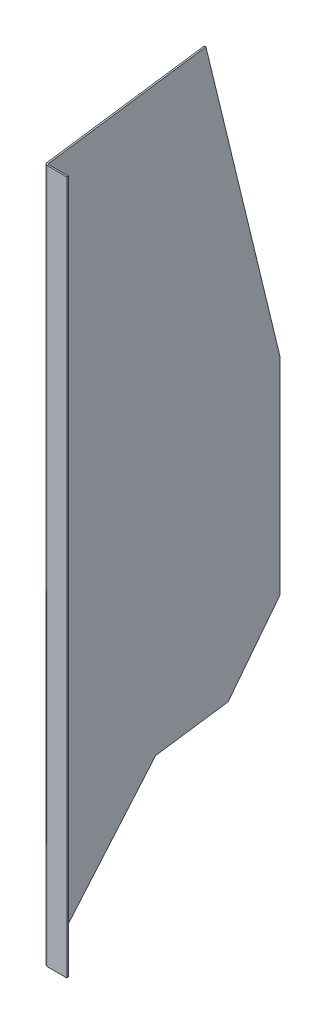
ISO-10303-21;
HEADER;
FILE_DESCRIPTION(('STEP AP214'),'2;1');
FILE_NAME('part.step','',(''),(''),'','','');
FILE_SCHEMA(('AUTOMOTIVE_DESIGN { 1 0 10303 214 1 1 1 1 }'));
ENDSEC;
DATA;
#1=APPLICATION_CONTEXT('core data for automotive mechanical design processes');
#2=APPLICATION_PROTOCOL_DEFINITION('international standard','automotive_design',2000,#1);
#3=PRODUCT_CONTEXT('',#1,'mechanical');
#4=PRODUCT('Part','Part','',(#3));
#5=PRODUCT_RELATED_PRODUCT_CATEGORY('part','',(#4));
#6=PRODUCT_DEFINITION_FORMATION('','',#4);
#7=PRODUCT_DEFINITION_CONTEXT('part definition',#1,'design');
#8=PRODUCT_DEFINITION('design','',#6,#7);
#9=PRODUCT_DEFINITION_SHAPE('','',#8);
#10=(LENGTH_UNIT() NAMED_UNIT(*) SI_UNIT(.MILLI.,.METRE.));
#11=(NAMED_UNIT(*) PLANE_ANGLE_UNIT() SI_UNIT($,.RADIAN.));
#12=(NAMED_UNIT(*) SI_UNIT($,.STERADIAN.) SOLID_ANGLE_UNIT());
#13=UNCERTAINTY_MEASURE_WITH_UNIT(LENGTH_MEASURE(1.E-05),#10,'distance_accuracy_value','');
#14=(GEOMETRIC_REPRESENTATION_CONTEXT(3) GLOBAL_UNCERTAINTY_ASSIGNED_CONTEXT((#13)) GLOBAL_UNIT_ASSIGNED_CONTEXT((#10,
#11,#12)) REPRESENTATION_CONTEXT('',''));
#15=CARTESIAN_POINT('',(0.,0.,0.));
#16=DIRECTION('',(0.,0.,1.));
#17=DIRECTION('',(1.,0.,0.));
#18=AXIS2_PLACEMENT_3D('',#15,#16,#17);
#19=CARTESIAN_POINT('',(-521.,-28.5,611.));
#20=DIRECTION('',(0.,0.,1.));
#21=DIRECTION('',(1.,0.,0.));
#22=AXIS2_PLACEMENT_3D('',#19,#20,#21);
#23=PLANE('',#22);
#24=DIRECTION('',(0.,-1.,0.));
#25=VECTOR('',#24,1.);
#26=CARTESIAN_POINT('',(-521.,-28.5,611.));
#27=LINE('',#26,#25);
#28=CARTESIAN_POINT('',(-521.,-28.5,611.));
#29=VERTEX_POINT('',#28);
#30=CARTESIAN_POINT('',(-521.,-908.,611.));
#31=VERTEX_POINT('',#30);
#32=EDGE_CURVE('E33',#29,#31,#27,.T.);
#33=ORIENTED_EDGE('',*,*,#32,.F.);
#34=DIRECTION('',(-1.,0.,0.));
#35=VECTOR('',#34,1.);
#36=CARTESIAN_POINT('',(-521.,-28.5,611.));
#37=LINE('',#36,#35);
#38=CARTESIAN_POINT('',(-545.81965059919,-28.5,611.));
#39=VERTEX_POINT('',#38);
#40=EDGE_CURVE('E11',#29,#39,#37,.T.);
#41=ORIENTED_EDGE('',*,*,#40,.T.);
#42=DIRECTION('',(0.,-1.,0.));
#43=VECTOR('',#42,1.);
#44=CARTESIAN_POINT('',(-545.81965059919,-28.5,611.));
#45=LINE('',#44,#43);
#46=CARTESIAN_POINT('',(-545.81965059919,-908.,611.));
#47=VERTEX_POINT('',#46);
#48=EDGE_CURVE('E26',#39,#47,#45,.T.);
#49=ORIENTED_EDGE('',*,*,#48,.T.);
#50=DIRECTION('',(1.,0.,0.));
#51=VECTOR('',#50,1.);
#52=CARTESIAN_POINT('',(-545.81965059919,-908.,611.));
#53=LINE('',#52,#51);
#54=EDGE_CURVE('E161',#47,#31,#53,.T.);
#55=ORIENTED_EDGE('',*,*,#54,.T.);
#56=EDGE_LOOP('',(#33,#41,#49,#55));
#57=FACE_BOUND('',#56,.T.);
#58=ADVANCED_FACE('F17',(#57),#23,.T.);
#59=CARTESIAN_POINT('',(-534.55828480544,-908.,610.));
#60=DIRECTION('',(0.,-1.,0.));
#61=DIRECTION('',(1.,0.,0.));
#62=AXIS2_PLACEMENT_3D('',#59,#60,#61);
#63=PLANE('',#62);
#64=DIRECTION('',(1.,0.,0.));
#65=VECTOR('',#64,1.);
#66=CARTESIAN_POINT('',(-545.81965059919,-908.,609.));
#67=LINE('',#66,#65);
#68=CARTESIAN_POINT('',(-545.81965059919,-908.,609.));
#69=VERTEX_POINT('',#68);
#70=CARTESIAN_POINT('',(-521.,-908.,609.));
#71=VERTEX_POINT('',#70);
#72=EDGE_CURVE('E158',#69,#71,#67,.T.);
#73=ORIENTED_EDGE('',*,*,#72,.T.);
#74=DIRECTION('',(0.,0.,-1.));
#75=VECTOR('',#74,1.);
#76=CARTESIAN_POINT('',(-521.,-908.,611.));
#77=LINE('',#76,#75);
#78=EDGE_CURVE('E104',#31,#71,#77,.T.);
#79=ORIENTED_EDGE('',*,*,#78,.F.);
#80=ORIENTED_EDGE('',*,*,#54,.F.);
#81=DIRECTION('',(0.,0.,-1.));
#82=VECTOR('',#81,1.);
#83=CARTESIAN_POINT('',(-545.81965059919,-908.,611.));
#84=LINE('',#83,#82);
#85=EDGE_CURVE('E132',#47,#69,#84,.T.);
#86=ORIENTED_EDGE('',*,*,#85,.T.);
#87=EDGE_LOOP('',(#73,#79,#80,#86));
#88=FACE_BOUND('',#87,.T.);
#89=ADVANCED_FACE('F176',(#88),#63,.T.);
#90=CARTESIAN_POINT('',(-549.39217522634,-905.1582556658,607.843923178521));
#91=CARTESIAN_POINT('',(-548.73059659168,-905.1582556658,607.761715182499));
#92=CARTESIAN_POINT('',(-548.06901795702,-905.1582556658,607.679507186476));
#93=CARTESIAN_POINT('',(-547.40743932237,-905.1582556658,607.597299190454));
#94=CARTESIAN_POINT('',(-549.3707608211,-905.252980477,608.016258154026));
#95=CARTESIAN_POINT('',(-548.71314781704,-905.252980477,607.902136273651));
#96=CARTESIAN_POINT('',(-548.05553481298,-905.252980477,607.788014393276));
#97=CARTESIAN_POINT('',(-547.39792180893,-905.252980477,607.673892512901));
#98=CARTESIAN_POINT('',(-549.30294884046,-905.4424300992,608.357822206609));
#99=CARTESIAN_POINT('',(-548.6578936106,-905.4424300992,608.180447723904));
#100=CARTESIAN_POINT('',(-548.01283838073,-905.4424300992,608.003073241198));
#101=CARTESIAN_POINT('',(-547.36778315087,-905.4424300992,607.825698758493));
#102=CARTESIAN_POINT('',(-549.12840723641,-905.7266045327,608.850144767545));
#103=CARTESIAN_POINT('',(-548.51567452582,-905.7266045327,608.581599440222));
#104=CARTESIAN_POINT('',(-547.90294181522,-905.7266045327,608.313054112899));
#105=CARTESIAN_POINT('',(-547.29020910462,-905.7266045327,608.044508785576));
#106=CARTESIAN_POINT('',(-548.88469123288,-906.0107789661,609.312149599986));
#107=CARTESIAN_POINT('',(-548.31709111553,-906.0107789661,608.958047822211));
#108=CARTESIAN_POINT('',(-547.74949099818,-906.0107789661,608.603946044436));
#109=CARTESIAN_POINT('',(-547.18189088083,-906.0107789661,608.249844266661));
#110=CARTESIAN_POINT('',(-548.57689602365,-906.2949533995,609.734178208289));
#111=CARTESIAN_POINT('',(-548.06629501912,-906.2949533995,609.301922984532));
#112=CARTESIAN_POINT('',(-547.55569401459,-906.2949533995,608.869667760775));
#113=CARTESIAN_POINT('',(-547.04509301006,-906.2949533995,608.437412537017));
#114=CARTESIAN_POINT('',(-548.21145653276,-906.5791278329,610.107407355516));
#115=CARTESIAN_POINT('',(-547.76852950803,-906.5791278329,609.606035623013));
#116=CARTESIAN_POINT('',(-547.32560248329,-906.5791278329,609.10466389051));
#117=CARTESIAN_POINT('',(-546.88267545856,-906.5791278329,608.603292158007));
#118=CARTESIAN_POINT('',(-547.79601281599,-906.8633022663,610.424034164285));
#119=CARTESIAN_POINT('',(-547.43001981288,-906.8633022663,609.864027837566));
#120=CARTESIAN_POINT('',(-547.06402680977,-906.8633022663,609.304021510846));
#121=CARTESIAN_POINT('',(-546.69803380666,-906.8633022663,608.744015184127));
#122=CARTESIAN_POINT('',(-547.33925030928,-907.1474766997,610.677439076468));
#123=CARTESIAN_POINT('',(-547.05784295556,-907.1474766997,610.070505914159));
#124=CARTESIAN_POINT('',(-546.77643560184,-907.1474766997,609.46357275185));
#125=CARTESIAN_POINT('',(-546.49502824812,-907.1474766997,608.856639589541));
#126=CARTESIAN_POINT('',(-546.85071841353,-907.4316511332,610.862324290621));
#127=CARTESIAN_POINT('',(-546.6597799294,-907.4316511332,610.221153125691));
#128=CARTESIAN_POINT('',(-546.46884144526,-907.4316511332,609.579981960761));
#129=CARTESIAN_POINT('',(-546.27790296112,-907.4316511332,608.938810795831));
#130=CARTESIAN_POINT('',(-546.34063020878,-907.7158255666,610.974824508069));
#131=CARTESIAN_POINT('',(-546.2441525033,-907.7158255666,610.312819969538));
#132=CARTESIAN_POINT('',(-546.14767479782,-907.7158255666,609.650815431006));
#133=CARTESIAN_POINT('',(-546.05119709234,-907.7158255666,608.988810892475));
#134=CARTESIAN_POINT('',(-545.9933109589,-907.9052751889,611.));
#135=CARTESIAN_POINT('',(-545.96115163303,-907.9052751889,610.333333333333));
#136=CARTESIAN_POINT('',(-545.92899230716,-907.9052751889,609.666666666667));
#137=CARTESIAN_POINT('',(-545.89683298128,-907.9052751889,609.));
#138=CARTESIAN_POINT('',(-545.81965059919,-908.,611.));
#139=CARTESIAN_POINT('',(-545.81965059919,-908.,610.333333333333));
#140=CARTESIAN_POINT('',(-545.81965059919,-908.,609.666666666667));
#141=CARTESIAN_POINT('',(-545.81965059919,-908.,609.));
#142=(BOUNDED_SURFACE() B_SPLINE_SURFACE(3,3,((#90,#91,#92,#93),(#94,#95,#96,#97),(#98,#99,#100,
#101),(#102,#103,#104,#105),(#106,#107,#108,#109),(#110,#111,#112,#113),(#114,#115,#116,#117),
(#118,#119,#120,#121),(#122,#123,#124,#125),(#126,#127,#128,#129),(#130,#131,#132,#133),(#134,
#135,#136,#137),(#138,#139,#140,#141)),.UNSPECIFIED.,.F.,.F.,
.F.) B_SPLINE_SURFACE_WITH_KNOTS((4,1,1,1,1,1,1,1,1,1,4),(4,4),(0.,0.1,0.2,0.3,0.4,0.5,0.6,0.7,
0.8,0.9,1.),(0.,1.),
.UNSPECIFIED.) GEOMETRIC_REPRESENTATION_ITEM() RATIONAL_B_SPLINE_SURFACE(((1.,1.,1.,1.),(1.,1.,
1.,1.),(1.,1.,1.,1.),(1.,1.,1.,1.),(1.,1.,1.,1.),(1.,1.,1.,1.),(1.,1.,1.,1.),(1.,1.,1.,1.),(1.,
1.,1.,1.),(1.,1.,1.,1.),(1.,1.,1.,1.),(1.,1.,1.,1.),(1.,1.,1.,1.))) REPRESENTATION_ITEM('') SURFACE());
#143=DIRECTION('',(0.992367951985267,0.,-0.123311994033696));
#144=VECTOR('',#143,1.);
#145=CARTESIAN_POINT('',(-549.39217522634,-905.1582556658,607.843923178521));
#146=LINE('',#145,#144);
#147=CARTESIAN_POINT('',(-549.39217522634,-905.1582556658,607.843923178521));
#148=VERTEX_POINT('',#147);
#149=CARTESIAN_POINT('',(-547.40743932237,-905.1582556658,607.597299190454));
#150=VERTEX_POINT('',#149);
#151=EDGE_CURVE('E130',#148,#150,#146,.T.);
#152=CARTESIAN_POINT('',(-547.40743932237,-905.1582556658,607.597299190454));
#153=CARTESIAN_POINT('',(-547.39792180893,-905.252980477,607.673892512901));
#154=CARTESIAN_POINT('',(-547.36778315087,-905.4424300992,607.825698758493));
#155=CARTESIAN_POINT('',(-547.29020910462,-905.7266045327,608.044508785576));
#156=CARTESIAN_POINT('',(-547.18189088083,-906.0107789661,608.249844266661));
#157=CARTESIAN_POINT('',(-547.04509301006,-906.2949533995,608.437412537017));
#158=CARTESIAN_POINT('',(-546.88267545856,-906.5791278329,608.603292158007));
#159=CARTESIAN_POINT('',(-546.69803380666,-906.8633022663,608.744015184127));
#160=CARTESIAN_POINT('',(-546.49502824812,-907.1474766997,608.856639589541));
#161=CARTESIAN_POINT('',(-546.27790296112,-907.4316511332,608.938810795831));
#162=CARTESIAN_POINT('',(-546.05119709234,-907.7158255666,608.988810892475));
#163=CARTESIAN_POINT('',(-545.89683298128,-907.9052751889,609.));
#164=CARTESIAN_POINT('',(-545.81965059919,-908.,609.));
#165=(BOUNDED_CURVE() B_SPLINE_CURVE(3,(#152,#153,#154,#155,#156,#157,#158,#159,#160,#161,#162,
#163,#164),.UNSPECIFIED.,.F.,.F.) B_SPLINE_CURVE_WITH_KNOTS((4,1,1,1,1,1,1,1,1,1,4),(0.,0.1,0.2,
0.3,0.4,0.5,0.6,0.7,0.8,0.9,1.),
.UNSPECIFIED.) CURVE() GEOMETRIC_REPRESENTATION_ITEM() RATIONAL_B_SPLINE_CURVE((1.,1.,1.,1.,1.,
1.,1.,1.,1.,1.,1.,1.,1.)) REPRESENTATION_ITEM(''));
#166=EDGE_CURVE('E133',#150,#69,#165,.T.);
#167=CARTESIAN_POINT('',(-549.39217522634,-905.1582556658,607.843923178521));
#168=CARTESIAN_POINT('',(-549.3707608211,-905.252980477,608.016258154026));
#169=CARTESIAN_POINT('',(-549.30294884046,-905.4424300992,608.357822206609));
#170=CARTESIAN_POINT('',(-549.12840723641,-905.7266045327,608.850144767545));
#171=CARTESIAN_POINT('',(-548.88469123288,-906.0107789661,609.312149599986));
#172=CARTESIAN_POINT('',(-548.57689602365,-906.2949533995,609.734178208289));
#173=CARTESIAN_POINT('',(-548.21145653276,-906.5791278329,610.107407355516));
#174=CARTESIAN_POINT('',(-547.79601281599,-906.8633022663,610.424034164285));
#175=CARTESIAN_POINT('',(-547.33925030928,-907.1474766997,610.677439076468));
#176=CARTESIAN_POINT('',(-546.85071841353,-907.4316511332,610.862324290621));
#177=CARTESIAN_POINT('',(-546.34063020878,-907.7158255666,610.974824508069));
#178=CARTESIAN_POINT('',(-545.9933109589,-907.9052751889,611.));
#179=CARTESIAN_POINT('',(-545.81965059919,-908.,611.));
#180=(BOUNDED_CURVE() B_SPLINE_CURVE(3,(#167,#168,#169,#170,#171,#172,#173,#174,#175,#176,#177,
#178,#179),.UNSPECIFIED.,.F.,.F.) B_SPLINE_CURVE_WITH_KNOTS((4,1,1,1,1,1,1,1,1,1,4),(0.,0.1,0.2,
0.3,0.4,0.5,0.6,0.7,0.8,0.9,1.),
.UNSPECIFIED.) CURVE() GEOMETRIC_REPRESENTATION_ITEM() RATIONAL_B_SPLINE_CURVE((1.,1.,1.,1.,1.,
1.,1.,1.,1.,1.,1.,1.,1.)) REPRESENTATION_ITEM(''));
#181=EDGE_CURVE('E189',#148,#47,#180,.T.);
#182=ORIENTED_EDGE('',*,*,#151,.T.);
#183=ORIENTED_EDGE('',*,*,#166,.T.);
#184=ORIENTED_EDGE('',*,*,#85,.F.);
#185=ORIENTED_EDGE('',*,*,#181,.F.);
#186=EDGE_LOOP('',(#182,#183,#184,#185));
#187=FACE_BOUND('',#186,.T.);
#188=ADVANCED_FACE('F233',(#187),#142,.F.);
#189=CARTESIAN_POINT('',(-545.81965059919,-28.5,607.4));
#190=DIRECTION('',(0.,1.,0.));
#191=DIRECTION('',(-0.992367951985267,0.,0.123311994033696));
#192=AXIS2_PLACEMENT_3D('',#189,#190,#191);
#193=CYLINDRICAL_SURFACE('',#192,3.6);
#194=ORIENTED_EDGE('',*,*,#181,.T.);
#195=ORIENTED_EDGE('',*,*,#48,.F.);
#196=CARTESIAN_POINT('',(-545.81965059919,-28.5,607.4));
#197=DIRECTION('',(0.,1.,0.));
#198=DIRECTION('',(-0.992367951985267,0.,0.123311994033696));
#199=AXIS2_PLACEMENT_3D('',#196,#197,#198);
#200=CIRCLE('',#199,3.6);
#201=CARTESIAN_POINT('',(-549.39217522634,-28.5,607.843923178521));
#202=VERTEX_POINT('',#201);
#203=EDGE_CURVE('E42',#202,#39,#200,.T.);
#204=ORIENTED_EDGE('',*,*,#203,.F.);
#205=DIRECTION('',(0.,-1.,0.));
#206=VECTOR('',#205,1.);
#207=CARTESIAN_POINT('',(-549.39217522634,-28.5,607.843923178521));
#208=LINE('',#207,#206);
#209=EDGE_CURVE('E141',#202,#148,#208,.T.);
#210=ORIENTED_EDGE('',*,*,#209,.T.);
#211=EDGE_LOOP('',(#194,#195,#204,#210));
#212=FACE_BOUND('',#211,.T.);
#213=ADVANCED_FACE('F239',(#212),#193,.T.);
#214=CARTESIAN_POINT('',(-549.,-28.5,611.));
#215=DIRECTION('',(-0.992367951985267,0.,0.123311994033696));
#216=DIRECTION('',(0.,-1.,0.));
#217=AXIS2_PLACEMENT_3D('',#214,#215,#216);
#218=PLANE('',#217);
#219=ORIENTED_EDGE('',*,*,#209,.F.);
#220=DIRECTION('',(-0.123311994033696,0.,-0.992367951985267));
#221=VECTOR('',#220,1.);
#222=CARTESIAN_POINT('',(-549.39217522634,-28.5,607.843923178521));
#223=LINE('',#222,#221);
#224=CARTESIAN_POINT('',(-577.68181528745,-28.5,380.1796769724));
#225=VERTEX_POINT('',#224);
#226=EDGE_CURVE('E139',#202,#225,#223,.T.);
#227=ORIENTED_EDGE('',*,*,#226,.T.);
#228=DIRECTION('',(-0.0321443268651114,-0.965426672144242,-0.258685297152511));
#229=VECTOR('',#228,1.);
#230=CARTESIAN_POINT('',(-577.68181528745,-28.5,380.1796769724));
#231=LINE('',#230,#229);
#232=CARTESIAN_POINT('',(-591.,-428.5,273.));
#233=VERTEX_POINT('',#232);
#234=EDGE_CURVE('E142',#225,#233,#231,.T.);
#235=ORIENTED_EDGE('',*,*,#234,.T.);
#236=DIRECTION('',(0.,-1.,0.));
#237=VECTOR('',#236,1.);
#238=CARTESIAN_POINT('',(-591.,-428.5,273.));
#239=LINE('',#238,#237);
#240=CARTESIAN_POINT('',(-591.,-690.7361610009,273.));
#241=VERTEX_POINT('',#240);
#242=EDGE_CURVE('E143',#233,#241,#239,.T.);
#243=ORIENTED_EDGE('',*,*,#242,.T.);
#244=DIRECTION('',(0.0875281168452047,-0.704392940325757,0.704392940325757));
#245=VECTOR('',#244,1.);
#246=CARTESIAN_POINT('',(-591.,-690.7361610009,273.));
#247=LINE('',#246,#245);
#248=CARTESIAN_POINT('',(-581.68047337278,-765.7361610009,348.));
#249=VERTEX_POINT('',#248);
#250=EDGE_CURVE('E107',#241,#249,#247,.T.);
#251=ORIENTED_EDGE('',*,*,#250,.T.);
#252=DIRECTION('',(0.123311994033696,0.,0.992367951985267));
#253=VECTOR('',#252,1.);
#254=CARTESIAN_POINT('',(-581.68047337278,-765.7361610009,348.));
#255=LINE('',#254,#253);
#256=CARTESIAN_POINT('',(-568.63313609467,-765.7361610009,453.));
#257=VERTEX_POINT('',#256);
#258=EDGE_CURVE('E99',#249,#257,#255,.T.);
#259=ORIENTED_EDGE('',*,*,#258,.T.);
#260=DIRECTION('',(0.0919522195150205,-0.666295781255203,0.739996433239904));
#261=VECTOR('',#260,1.);
#262=CARTESIAN_POINT('',(-568.63313609467,-765.7361610009,453.));
#263=LINE('',#262,#261);
#264=EDGE_CURVE('E108',#257,#148,#263,.T.);
#265=ORIENTED_EDGE('',*,*,#264,.T.);
#266=EDGE_LOOP('',(#219,#227,#235,#243,#251,#259,#265));
#267=FACE_BOUND('',#266,.T.);
#268=ADVANCED_FACE('F237',(#267),#218,.T.);
#269=CARTESIAN_POINT('',(-558.02028770852,-835.4472083334,530.29864959523));
#270=DIRECTION('',(-0.0821622614028132,-0.745687556474929,-0.661210579860626));
#271=DIRECTION('',(-0.992367951985268,0.,0.123311994033693));
#272=AXIS2_PLACEMENT_3D('',#269,#270,#271);
#273=PLANE('',#272);
#274=DIRECTION('',(0.992367951985267,0.,-0.123311994033696));
#275=VECTOR('',#274,1.);
#276=CARTESIAN_POINT('',(-568.63313609467,-765.7361610009,453.));
#277=LINE('',#276,#275);
#278=CARTESIAN_POINT('',(-566.6484001907,-765.7361610009,452.7533760119));
#279=VERTEX_POINT('',#278);
#280=EDGE_CURVE('E156',#257,#279,#277,.T.);
#281=ORIENTED_EDGE('',*,*,#280,.T.);
#282=DIRECTION('',(0.0919522195150205,-0.666295781255203,0.739996433239904));
#283=VECTOR('',#282,1.);
#284=CARTESIAN_POINT('',(-566.6484001907,-765.7361610009,452.7533760119));
#285=LINE('',#284,#283);
#286=EDGE_CURVE('E72',#279,#150,#285,.T.);
#287=ORIENTED_EDGE('',*,*,#286,.T.);
#288=ORIENTED_EDGE('',*,*,#151,.F.);
#289=ORIENTED_EDGE('',*,*,#264,.F.);
#290=EDGE_LOOP('',(#281,#287,#288,#289));
#291=FACE_BOUND('',#290,.T.);
#292=ADVANCED_FACE('F235',(#291),#273,.T.);
#293=CARTESIAN_POINT('',(-547.01526409603,-28.5,610.753376011933));
#294=DIRECTION('',(-0.992367951985267,0.,0.123311994033696));
#295=DIRECTION('',(0.,-1.,0.));
#296=AXIS2_PLACEMENT_3D('',#293,#294,#295);
#297=PLANE('',#296);
#298=DIRECTION('',(0.123311994033696,0.,0.992367951985267));
#299=VECTOR('',#298,1.);
#300=CARTESIAN_POINT('',(-579.69573746881,-765.7361610009,347.7533760119));
#301=LINE('',#300,#299);
#302=CARTESIAN_POINT('',(-579.69573746881,-765.7361610009,347.7533760119));
#303=VERTEX_POINT('',#302);
#304=EDGE_CURVE('E78',#303,#279,#301,.T.);
#305=ORIENTED_EDGE('',*,*,#304,.F.);
#306=DIRECTION('',(0.0875281168452047,-0.704392940325757,0.704392940325757));
#307=VECTOR('',#306,1.);
#308=CARTESIAN_POINT('',(-589.01526409603,-690.7361610009,272.7533760119));
#309=LINE('',#308,#307);
#310=CARTESIAN_POINT('',(-589.01526409603,-690.7361610009,272.7533760119));
#311=VERTEX_POINT('',#310);
#312=EDGE_CURVE('E81',#311,#303,#309,.T.);
#313=ORIENTED_EDGE('',*,*,#312,.F.);
#314=DIRECTION('',(0.,-1.,0.));
#315=VECTOR('',#314,1.);
#316=CARTESIAN_POINT('',(-589.01526409603,-428.5,272.7533760119));
#317=LINE('',#316,#315);
#318=CARTESIAN_POINT('',(-589.01526409603,-428.5,272.7533760119));
#319=VERTEX_POINT('',#318);
#320=EDGE_CURVE('E166',#319,#311,#317,.T.);
#321=ORIENTED_EDGE('',*,*,#320,.F.);
#322=DIRECTION('',(-0.0321443268651114,-0.965426672144242,-0.258685297152511));
#323=VECTOR('',#322,1.);
#324=CARTESIAN_POINT('',(-575.69707938348,-28.5,379.9330529844));
#325=LINE('',#324,#323);
#326=CARTESIAN_POINT('',(-575.69707938348,-28.5,379.9330529844));
#327=VERTEX_POINT('',#326);
#328=EDGE_CURVE('E116',#327,#319,#325,.T.);
#329=ORIENTED_EDGE('',*,*,#328,.F.);
#330=DIRECTION('',(-0.123311994033696,0.,-0.992367951985267));
#331=VECTOR('',#330,1.);
#332=CARTESIAN_POINT('',(-547.40743932237,-28.5,607.597299190454));
#333=LINE('',#332,#331);
#334=CARTESIAN_POINT('',(-547.40743932237,-28.5,607.597299190454));
#335=VERTEX_POINT('',#334);
#336=EDGE_CURVE('E114',#335,#327,#333,.T.);
#337=ORIENTED_EDGE('',*,*,#336,.F.);
#338=DIRECTION('',(0.,-1.,0.));
#339=VECTOR('',#338,1.);
#340=CARTESIAN_POINT('',(-547.40743932237,-28.5,607.597299190454));
#341=LINE('',#340,#339);
#342=EDGE_CURVE('E109',#335,#150,#341,.T.);
#343=ORIENTED_EDGE('',*,*,#342,.T.);
#344=ORIENTED_EDGE('',*,*,#286,.F.);
#345=EDGE_LOOP('',(#305,#313,#321,#329,#337,#343,#344));
#346=FACE_BOUND('',#345,.T.);
#347=ADVANCED_FACE('F80',(#346),#297,.F.);
#348=CARTESIAN_POINT('',(-545.81965059919,-28.5,607.4));
#349=DIRECTION('',(0.,1.,0.));
#350=DIRECTION('',(-0.992367951985267,0.,0.123311994033696));
#351=AXIS2_PLACEMENT_3D('',#348,#349,#350);
#352=CYLINDRICAL_SURFACE('',#351,1.6);
#353=CARTESIAN_POINT('',(-545.81965059919,-28.5,607.4));
#354=DIRECTION('',(0.,1.,0.));
#355=DIRECTION('',(-0.992367951985267,0.,0.123311994033696));
#356=AXIS2_PLACEMENT_3D('',#353,#354,#355);
#357=CIRCLE('',#356,1.6);
#358=CARTESIAN_POINT('',(-545.81965059919,-28.5,609.));
#359=VERTEX_POINT('',#358);
#360=EDGE_CURVE('E21',#335,#359,#357,.T.);
#361=ORIENTED_EDGE('',*,*,#360,.T.);
#362=DIRECTION('',(0.,-1.,0.));
#363=VECTOR('',#362,1.);
#364=CARTESIAN_POINT('',(-545.81965059919,-28.5,609.));
#365=LINE('',#364,#363);
#366=EDGE_CURVE('E135',#359,#69,#365,.T.);
#367=ORIENTED_EDGE('',*,*,#366,.T.);
#368=ORIENTED_EDGE('',*,*,#166,.F.);
#369=ORIENTED_EDGE('',*,*,#342,.F.);
#370=EDGE_LOOP('',(#361,#367,#368,#369));
#371=FACE_BOUND('',#370,.T.);
#372=ADVANCED_FACE('F228',(#371),#352,.F.);
#373=CARTESIAN_POINT('',(-521.,-28.5,609.));
#374=DIRECTION('',(0.,0.,1.));
#375=DIRECTION('',(1.,0.,0.));
#376=AXIS2_PLACEMENT_3D('',#373,#374,#375);
#377=PLANE('',#376);
#378=ORIENTED_EDGE('',*,*,#366,.F.);
#379=DIRECTION('',(-1.,0.,0.));
#380=VECTOR('',#379,1.);
#381=CARTESIAN_POINT('',(-521.,-28.5,609.));
#382=LINE('',#381,#380);
#383=CARTESIAN_POINT('',(-521.,-28.5,609.));
#384=VERTEX_POINT('',#383);
#385=EDGE_CURVE('E122',#384,#359,#382,.T.);
#386=ORIENTED_EDGE('',*,*,#385,.F.);
#387=DIRECTION('',(0.,-1.,0.));
#388=VECTOR('',#387,1.);
#389=CARTESIAN_POINT('',(-521.,-28.5,609.));
#390=LINE('',#389,#388);
#391=EDGE_CURVE('E138',#384,#71,#390,.T.);
#392=ORIENTED_EDGE('',*,*,#391,.T.);
#393=ORIENTED_EDGE('',*,*,#72,.F.);
#394=EDGE_LOOP('',(#378,#386,#392,#393));
#395=FACE_BOUND('',#394,.T.);
#396=ADVANCED_FACE('F246',(#395),#377,.F.);
#397=CARTESIAN_POINT('',(-521.,-468.25,610.));
#398=DIRECTION('',(-1.,0.,0.));
#399=DIRECTION('',(0.,-1.,0.));
#400=AXIS2_PLACEMENT_3D('',#397,#398,#399);
#401=PLANE('',#400);
#402=ORIENTED_EDGE('',*,*,#78,.T.);
#403=ORIENTED_EDGE('',*,*,#391,.F.);
#404=DIRECTION('',(0.,0.,-1.));
#405=VECTOR('',#404,1.);
#406=CARTESIAN_POINT('',(-521.,-28.5,611.));
#407=LINE('',#406,#405);
#408=EDGE_CURVE('E125',#29,#384,#407,.T.);
#409=ORIENTED_EDGE('',*,*,#408,.F.);
#410=ORIENTED_EDGE('',*,*,#32,.T.);
#411=EDGE_LOOP('',(#402,#403,#409,#410));
#412=FACE_BOUND('',#411,.T.);
#413=ADVANCED_FACE('F19',(#412),#401,.F.);
#414=CARTESIAN_POINT('',(-534.55828480544,-28.5,610.));
#415=DIRECTION('',(0.,1.,0.));
#416=DIRECTION('',(0.,0.,-1.));
#417=AXIS2_PLACEMENT_3D('',#414,#415,#416);
#418=PLANE('',#417);
#419=ORIENTED_EDGE('',*,*,#40,.F.);
#420=ORIENTED_EDGE('',*,*,#408,.T.);
#421=ORIENTED_EDGE('',*,*,#385,.T.);
#422=DIRECTION('',(0.,0.,-1.));
#423=VECTOR('',#422,1.);
#424=CARTESIAN_POINT('',(-545.81965059919,-28.5,611.));
#425=LINE('',#424,#423);
#426=EDGE_CURVE('E126',#39,#359,#425,.T.);
#427=ORIENTED_EDGE('',*,*,#426,.F.);
#428=EDGE_LOOP('',(#419,#420,#421,#427));
#429=FACE_BOUND('',#428,.T.);
#430=ADVANCED_FACE('F241',(#429),#418,.T.);
#431=CARTESIAN_POINT('',(-547.54104696847,-28.5,609.348536512317));
#432=DIRECTION('',(0.,-1.,0.));
#433=DIRECTION('',(1.,0.,0.));
#434=AXIS2_PLACEMENT_3D('',#431,#432,#433);
#435=PLANE('',#434);
#436=ORIENTED_EDGE('',*,*,#426,.T.);
#437=ORIENTED_EDGE('',*,*,#360,.F.);
#438=DIRECTION('',(0.992367951985267,0.,-0.123311994033696));
#439=VECTOR('',#438,1.);
#440=CARTESIAN_POINT('',(-549.39217522634,-28.5,607.843923178521));
#441=LINE('',#440,#439);
#442=EDGE_CURVE('E111',#202,#335,#441,.T.);
#443=ORIENTED_EDGE('',*,*,#442,.F.);
#444=ORIENTED_EDGE('',*,*,#203,.T.);
#445=EDGE_LOOP('',(#436,#437,#443,#444));
#446=FACE_BOUND('',#445,.T.);
#447=ADVANCED_FACE('F225',(#446),#435,.F.);
#448=CARTESIAN_POINT('',(-562.40300847317,-28.5,495.0281824892));
#449=DIRECTION('',(0.,1.,0.));
#450=DIRECTION('',(0.,0.,-1.));
#451=AXIS2_PLACEMENT_3D('',#448,#449,#450);
#452=PLANE('',#451);
#453=ORIENTED_EDGE('',*,*,#336,.T.);
#454=DIRECTION('',(0.992367951985267,0.,-0.123311994033696));
#455=VECTOR('',#454,1.);
#456=CARTESIAN_POINT('',(-577.68181528745,-28.5,380.1796769724));
#457=LINE('',#456,#455);
#458=EDGE_CURVE('E115',#225,#327,#457,.T.);
#459=ORIENTED_EDGE('',*,*,#458,.F.);
#460=ORIENTED_EDGE('',*,*,#226,.F.);
#461=ORIENTED_EDGE('',*,*,#442,.T.);
#462=EDGE_LOOP('',(#453,#459,#460,#461));
#463=FACE_BOUND('',#462,.T.);
#464=ADVANCED_FACE('F217',(#463),#452,.T.);
#465=CARTESIAN_POINT('',(-583.34853969174,-228.5,326.4665264922));
#466=DIRECTION('',(-0.119048688035406,0.260674779586512,-0.958058489427745));
#467=DIRECTION('',(0.,0.964920601761245,0.262541867702501));
#468=AXIS2_PLACEMENT_3D('',#465,#466,#467);
#469=PLANE('',#468);
#470=ORIENTED_EDGE('',*,*,#458,.T.);
#471=ORIENTED_EDGE('',*,*,#328,.T.);
#472=DIRECTION('',(0.992367951985267,0.,-0.123311994033696));
#473=VECTOR('',#472,1.);
#474=CARTESIAN_POINT('',(-591.,-428.5,273.));
#475=LINE('',#474,#473);
#476=EDGE_CURVE('E119',#233,#319,#475,.T.);
#477=ORIENTED_EDGE('',*,*,#476,.F.);
#478=ORIENTED_EDGE('',*,*,#234,.F.);
#479=EDGE_LOOP('',(#470,#471,#477,#478));
#480=FACE_BOUND('',#479,.T.);
#481=ADVANCED_FACE('F213',(#480),#469,.T.);
#482=CARTESIAN_POINT('',(-590.00763204801,-559.6180805005,272.876688006));
#483=DIRECTION('',(-0.123311994033696,0.,-0.992367951985267));
#484=DIRECTION('',(-0.992367951985267,0.,0.123311994033696));
#485=AXIS2_PLACEMENT_3D('',#482,#483,#484);
#486=PLANE('',#485);
#487=ORIENTED_EDGE('',*,*,#476,.T.);
#488=ORIENTED_EDGE('',*,*,#320,.T.);
#489=DIRECTION('',(0.992367951985267,0.,-0.123311994033696));
#490=VECTOR('',#489,1.);
#491=CARTESIAN_POINT('',(-591.,-690.7361610009,273.));
#492=LINE('',#491,#490);
#493=EDGE_CURVE('E94',#241,#311,#492,.T.);
#494=ORIENTED_EDGE('',*,*,#493,.F.);
#495=ORIENTED_EDGE('',*,*,#242,.F.);
#496=EDGE_LOOP('',(#487,#488,#494,#495));
#497=FACE_BOUND('',#496,.T.);
#498=ADVANCED_FACE('F209',(#497),#486,.T.);
#499=CARTESIAN_POINT('',(-585.34786873441,-728.2361610009,310.376688006));
#500=DIRECTION('',(-0.0868600980548202,-0.709810246206102,-0.699016979584002));
#501=DIRECTION('',(-0.99236795198527,0.,0.123311994033677));
#502=AXIS2_PLACEMENT_3D('',#499,#500,#501);
#503=PLANE('',#502);
#504=ORIENTED_EDGE('',*,*,#493,.T.);
#505=ORIENTED_EDGE('',*,*,#312,.T.);
#506=DIRECTION('',(0.992367951985267,0.,-0.123311994033696));
#507=VECTOR('',#506,1.);
#508=CARTESIAN_POINT('',(-581.68047337278,-765.7361610009,348.));
#509=LINE('',#508,#507);
#510=EDGE_CURVE('E86',#249,#303,#509,.T.);
#511=ORIENTED_EDGE('',*,*,#510,.F.);
#512=ORIENTED_EDGE('',*,*,#250,.F.);
#513=EDGE_LOOP('',(#504,#505,#511,#512));
#514=FACE_BOUND('',#513,.T.);
#515=ADVANCED_FACE('F91',(#514),#503,.T.);
#516=CARTESIAN_POINT('',(-574.16443678174,-765.7361610009,400.376688006));
#517=DIRECTION('',(0.,-1.,0.));
#518=DIRECTION('',(1.,0.,0.));
#519=AXIS2_PLACEMENT_3D('',#516,#517,#518);
#520=PLANE('',#519);
#521=ORIENTED_EDGE('',*,*,#510,.T.);
#522=ORIENTED_EDGE('',*,*,#304,.T.);
#523=ORIENTED_EDGE('',*,*,#280,.F.);
#524=ORIENTED_EDGE('',*,*,#258,.F.);
#525=EDGE_LOOP('',(#521,#522,#523,#524));
#526=FACE_BOUND('',#525,.T.);
#527=ADVANCED_FACE('F97',(#526),#520,.T.);
#528=CLOSED_SHELL('',(#58,#89,#188,#213,#268,#292,#347,#372,#396,#413,#430,#447,#464,#481,#498,
#515,#527));
#529=MANIFOLD_SOLID_BREP('B1',#528);
#530=ADVANCED_BREP_SHAPE_REPRESENTATION('',(#18,#529),#14);
#531=SHAPE_DEFINITION_REPRESENTATION(#9,#530);
ENDSEC;
END-ISO-10303-21;
